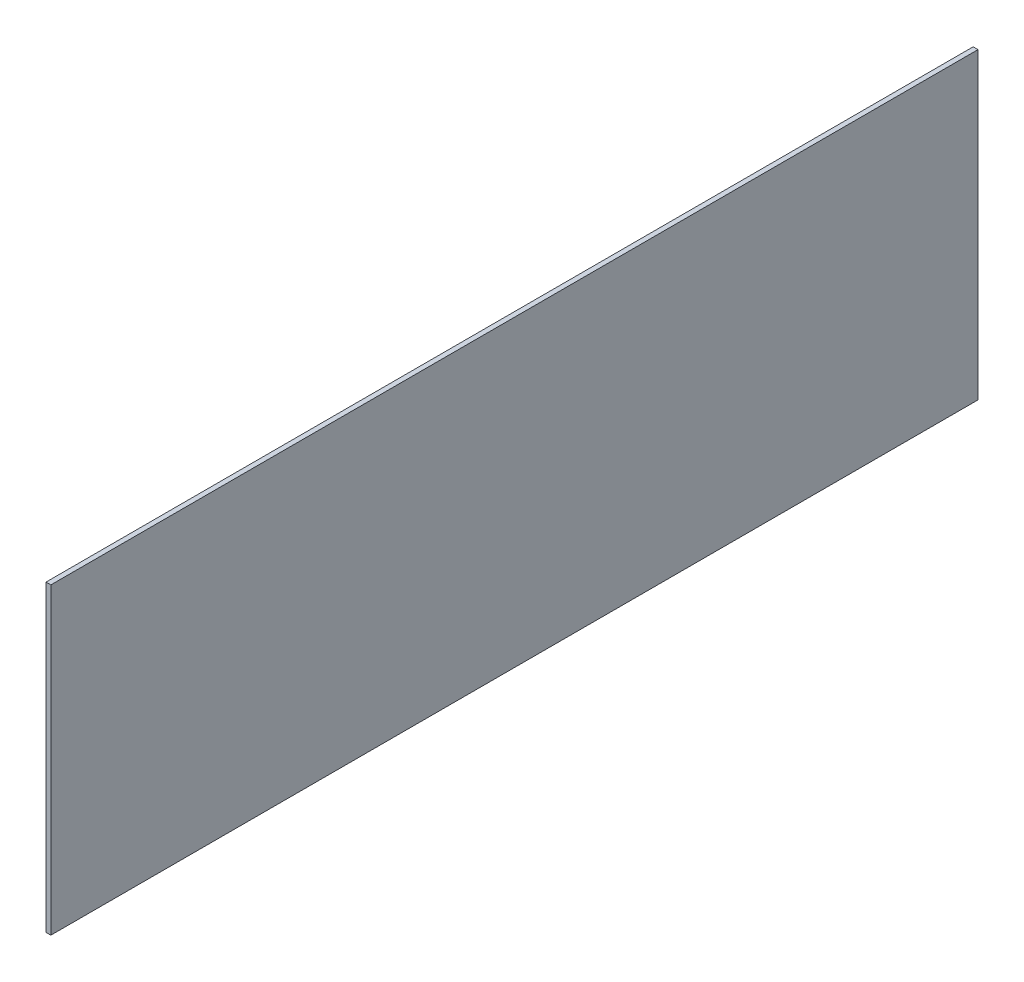
ISO-10303-21;
HEADER;
FILE_DESCRIPTION(('STEP AP214'),'2;1');
FILE_NAME('part.step','',(''),(''),'','','');
FILE_SCHEMA(('AUTOMOTIVE_DESIGN { 1 0 10303 214 1 1 1 1 }'));
ENDSEC;
DATA;
#1=APPLICATION_CONTEXT('core data for automotive mechanical design processes');
#2=APPLICATION_PROTOCOL_DEFINITION('international standard','automotive_design',2000,#1);
#3=PRODUCT_CONTEXT('',#1,'mechanical');
#4=PRODUCT('Part','Part','',(#3));
#5=PRODUCT_RELATED_PRODUCT_CATEGORY('part','',(#4));
#6=PRODUCT_DEFINITION_FORMATION('','',#4);
#7=PRODUCT_DEFINITION_CONTEXT('part definition',#1,'design');
#8=PRODUCT_DEFINITION('design','',#6,#7);
#9=PRODUCT_DEFINITION_SHAPE('','',#8);
#10=(LENGTH_UNIT() NAMED_UNIT(*) SI_UNIT(.MILLI.,.METRE.));
#11=(NAMED_UNIT(*) PLANE_ANGLE_UNIT() SI_UNIT($,.RADIAN.));
#12=(NAMED_UNIT(*) SI_UNIT($,.STERADIAN.) SOLID_ANGLE_UNIT());
#13=UNCERTAINTY_MEASURE_WITH_UNIT(LENGTH_MEASURE(1.E-05),#10,'distance_accuracy_value','');
#14=(GEOMETRIC_REPRESENTATION_CONTEXT(3) GLOBAL_UNCERTAINTY_ASSIGNED_CONTEXT((#13)) GLOBAL_UNIT_ASSIGNED_CONTEXT((#10,
#11,#12)) REPRESENTATION_CONTEXT('',''));
#15=CARTESIAN_POINT('',(0.,0.,0.));
#16=DIRECTION('',(0.,0.,1.));
#17=DIRECTION('',(1.,0.,0.));
#18=AXIS2_PLACEMENT_3D('',#15,#16,#17);
#19=CARTESIAN_POINT('',(534.,-75.,-382.));
#20=DIRECTION('',(0.,-1.,0.));
#21=DIRECTION('',(0.,0.,-1.));
#22=AXIS2_PLACEMENT_3D('',#19,#20,#21);
#23=PLANE('',#22);
#24=DIRECTION('',(0.,0.,1.));
#25=VECTOR('',#24,1.);
#26=CARTESIAN_POINT('',(532.,-75.,-382.));
#27=LINE('',#26,#25);
#28=CARTESIAN_POINT('',(532.,-75.,-382.));
#29=VERTEX_POINT('',#28);
#30=CARTESIAN_POINT('',(532.,-75.,0.));
#31=VERTEX_POINT('',#30);
#32=EDGE_CURVE('E100',#29,#31,#27,.T.);
#33=ORIENTED_EDGE('',*,*,#32,.F.);
#34=DIRECTION('',(-1.,0.,0.));
#35=VECTOR('',#34,1.);
#36=CARTESIAN_POINT('',(534.,-75.,-382.));
#37=LINE('',#36,#35);
#38=CARTESIAN_POINT('',(534.,-75.,-382.));
#39=VERTEX_POINT('',#38);
#40=EDGE_CURVE('E11',#39,#29,#37,.T.);
#41=ORIENTED_EDGE('',*,*,#40,.F.);
#42=DIRECTION('',(0.,0.,1.));
#43=VECTOR('',#42,1.);
#44=CARTESIAN_POINT('',(534.,-75.,-382.));
#45=LINE('',#44,#43);
#46=CARTESIAN_POINT('',(534.,-75.,0.));
#47=VERTEX_POINT('',#46);
#48=EDGE_CURVE('E94',#39,#47,#45,.T.);
#49=ORIENTED_EDGE('',*,*,#48,.T.);
#50=DIRECTION('',(-1.,0.,0.));
#51=VECTOR('',#50,1.);
#52=CARTESIAN_POINT('',(534.,-75.,0.));
#53=LINE('',#52,#51);
#54=EDGE_CURVE('E39',#47,#31,#53,.T.);
#55=ORIENTED_EDGE('',*,*,#54,.T.);
#56=EDGE_LOOP('',(#33,#41,#49,#55));
#57=FACE_BOUND('',#56,.T.);
#58=ADVANCED_FACE('F36',(#57),#23,.T.);
#59=CARTESIAN_POINT('',(534.,50.,-382.));
#60=DIRECTION('',(0.,0.,-1.));
#61=DIRECTION('',(-1.,0.,0.));
#62=AXIS2_PLACEMENT_3D('',#59,#60,#61);
#63=PLANE('',#62);
#64=DIRECTION('',(0.,-1.,0.));
#65=VECTOR('',#64,1.);
#66=CARTESIAN_POINT('',(532.,50.,-382.));
#67=LINE('',#66,#65);
#68=CARTESIAN_POINT('',(532.,50.,-382.));
#69=VERTEX_POINT('',#68);
#70=EDGE_CURVE('E96',#69,#29,#67,.T.);
#71=ORIENTED_EDGE('',*,*,#70,.F.);
#72=DIRECTION('',(-1.,0.,0.));
#73=VECTOR('',#72,1.);
#74=CARTESIAN_POINT('',(534.,50.,-382.));
#75=LINE('',#74,#73);
#76=CARTESIAN_POINT('',(534.,50.,-382.));
#77=VERTEX_POINT('',#76);
#78=EDGE_CURVE('E45',#77,#69,#75,.T.);
#79=ORIENTED_EDGE('',*,*,#78,.F.);
#80=DIRECTION('',(0.,-1.,0.));
#81=VECTOR('',#80,1.);
#82=CARTESIAN_POINT('',(534.,50.,-382.));
#83=LINE('',#82,#81);
#84=EDGE_CURVE('E91',#77,#39,#83,.T.);
#85=ORIENTED_EDGE('',*,*,#84,.T.);
#86=ORIENTED_EDGE('',*,*,#40,.T.);
#87=EDGE_LOOP('',(#71,#79,#85,#86));
#88=FACE_BOUND('',#87,.T.);
#89=ADVANCED_FACE('F110',(#88),#63,.T.);
#90=CARTESIAN_POINT('',(534.,50.,0.));
#91=DIRECTION('',(0.,1.,0.));
#92=DIRECTION('',(0.,0.,1.));
#93=AXIS2_PLACEMENT_3D('',#90,#91,#92);
#94=PLANE('',#93);
#95=DIRECTION('',(0.,0.,-1.));
#96=VECTOR('',#95,1.);
#97=CARTESIAN_POINT('',(532.,50.,0.));
#98=LINE('',#97,#96);
#99=CARTESIAN_POINT('',(532.,50.,0.));
#100=VERTEX_POINT('',#99);
#101=EDGE_CURVE('E86',#100,#69,#98,.T.);
#102=ORIENTED_EDGE('',*,*,#101,.F.);
#103=DIRECTION('',(-1.,0.,0.));
#104=VECTOR('',#103,1.);
#105=CARTESIAN_POINT('',(534.,50.,0.));
#106=LINE('',#105,#104);
#107=CARTESIAN_POINT('',(534.,50.,0.));
#108=VERTEX_POINT('',#107);
#109=EDGE_CURVE('E81',#108,#100,#106,.T.);
#110=ORIENTED_EDGE('',*,*,#109,.F.);
#111=DIRECTION('',(0.,0.,-1.));
#112=VECTOR('',#111,1.);
#113=CARTESIAN_POINT('',(534.,50.,0.));
#114=LINE('',#113,#112);
#115=EDGE_CURVE('E84',#108,#77,#114,.T.);
#116=ORIENTED_EDGE('',*,*,#115,.T.);
#117=ORIENTED_EDGE('',*,*,#78,.T.);
#118=EDGE_LOOP('',(#102,#110,#116,#117));
#119=FACE_BOUND('',#118,.T.);
#120=ADVANCED_FACE('F83',(#119),#94,.T.);
#121=CARTESIAN_POINT('',(534.,-75.,0.));
#122=DIRECTION('',(0.,0.,1.));
#123=DIRECTION('',(1.,0.,0.));
#124=AXIS2_PLACEMENT_3D('',#121,#122,#123);
#125=PLANE('',#124);
#126=DIRECTION('',(0.,1.,0.));
#127=VECTOR('',#126,1.);
#128=CARTESIAN_POINT('',(532.,-75.,0.));
#129=LINE('',#128,#127);
#130=EDGE_CURVE('E103',#31,#100,#129,.T.);
#131=ORIENTED_EDGE('',*,*,#130,.F.);
#132=ORIENTED_EDGE('',*,*,#54,.F.);
#133=DIRECTION('',(0.,1.,0.));
#134=VECTOR('',#133,1.);
#135=CARTESIAN_POINT('',(534.,-75.,0.));
#136=LINE('',#135,#134);
#137=EDGE_CURVE('E90',#47,#108,#136,.T.);
#138=ORIENTED_EDGE('',*,*,#137,.T.);
#139=ORIENTED_EDGE('',*,*,#109,.T.);
#140=EDGE_LOOP('',(#131,#132,#138,#139));
#141=FACE_BOUND('',#140,.T.);
#142=ADVANCED_FACE('F93',(#141),#125,.T.);
#143=CARTESIAN_POINT('',(534.,0.,0.));
#144=DIRECTION('',(-1.,0.,0.));
#145=DIRECTION('',(0.,0.,1.));
#146=AXIS2_PLACEMENT_3D('',#143,#144,#145);
#147=PLANE('',#146);
#148=ORIENTED_EDGE('',*,*,#48,.F.);
#149=ORIENTED_EDGE('',*,*,#84,.F.);
#150=ORIENTED_EDGE('',*,*,#115,.F.);
#151=ORIENTED_EDGE('',*,*,#137,.F.);
#152=EDGE_LOOP('',(#148,#149,#150,#151));
#153=FACE_BOUND('',#152,.T.);
#154=ADVANCED_FACE('F89',(#153),#147,.F.);
#155=CARTESIAN_POINT('',(532.,0.,0.));
#156=DIRECTION('',(-1.,0.,0.));
#157=DIRECTION('',(0.,0.,1.));
#158=AXIS2_PLACEMENT_3D('',#155,#156,#157);
#159=PLANE('',#158);
#160=ORIENTED_EDGE('',*,*,#32,.T.);
#161=ORIENTED_EDGE('',*,*,#130,.T.);
#162=ORIENTED_EDGE('',*,*,#101,.T.);
#163=ORIENTED_EDGE('',*,*,#70,.T.);
#164=EDGE_LOOP('',(#160,#161,#162,#163));
#165=FACE_BOUND('',#164,.T.);
#166=ADVANCED_FACE('F109',(#165),#159,.T.);
#167=CLOSED_SHELL('',(#58,#89,#120,#142,#154,#166));
#168=MANIFOLD_SOLID_BREP('B2',#167);
#169=ADVANCED_BREP_SHAPE_REPRESENTATION('',(#18,#168),#14);
#170=SHAPE_DEFINITION_REPRESENTATION(#9,#169);
ENDSEC;
END-ISO-10303-21;
